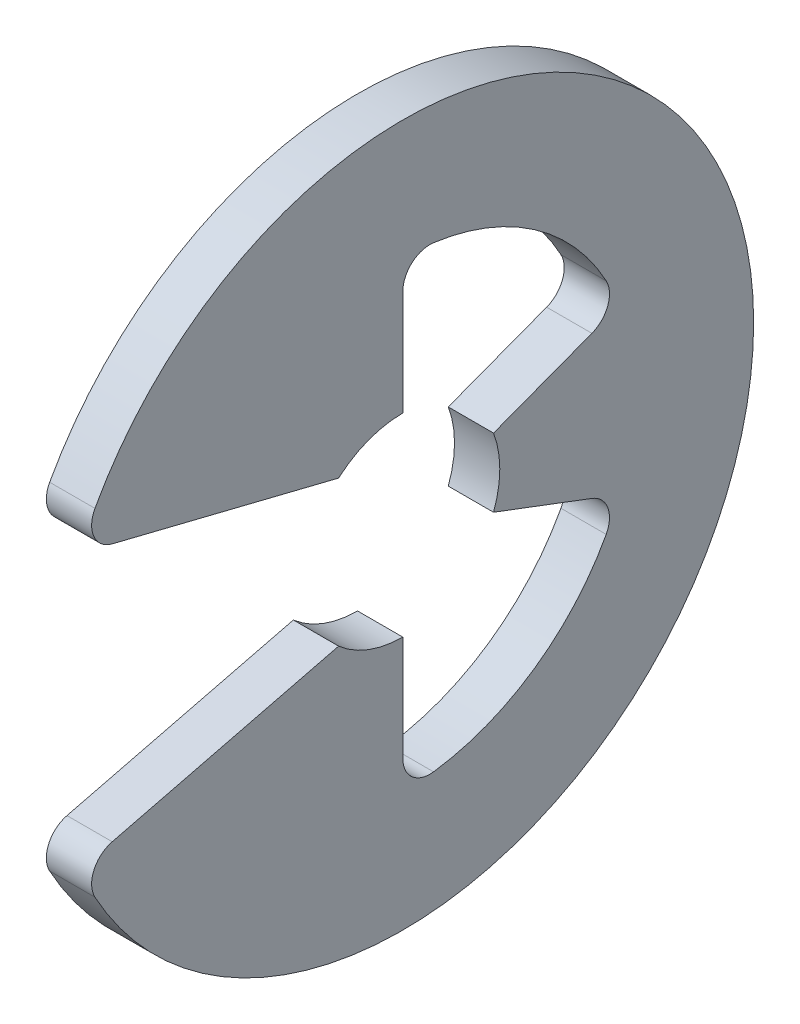
ISO-10303-21;
HEADER;
FILE_DESCRIPTION(('STEP AP214'),'2;1');
FILE_NAME('part.step','',(''),(''),'','','');
FILE_SCHEMA(('AUTOMOTIVE_DESIGN { 1 0 10303 214 1 1 1 1 }'));
ENDSEC;
DATA;
#1=APPLICATION_CONTEXT('core data for automotive mechanical design processes');
#2=APPLICATION_PROTOCOL_DEFINITION('international standard','automotive_design',2000,#1);
#3=PRODUCT_CONTEXT('',#1,'mechanical');
#4=PRODUCT('Part','Part','',(#3));
#5=PRODUCT_RELATED_PRODUCT_CATEGORY('part','',(#4));
#6=PRODUCT_DEFINITION_FORMATION('','',#4);
#7=PRODUCT_DEFINITION_CONTEXT('part definition',#1,'design');
#8=PRODUCT_DEFINITION('design','',#6,#7);
#9=PRODUCT_DEFINITION_SHAPE('','',#8);
#10=(LENGTH_UNIT() NAMED_UNIT(*) SI_UNIT(.MILLI.,.METRE.));
#11=(NAMED_UNIT(*) PLANE_ANGLE_UNIT() SI_UNIT($,.RADIAN.));
#12=(NAMED_UNIT(*) SI_UNIT($,.STERADIAN.) SOLID_ANGLE_UNIT());
#13=UNCERTAINTY_MEASURE_WITH_UNIT(LENGTH_MEASURE(1.E-05),#10,'distance_accuracy_value','');
#14=(GEOMETRIC_REPRESENTATION_CONTEXT(3) GLOBAL_UNCERTAINTY_ASSIGNED_CONTEXT((#13)) GLOBAL_UNIT_ASSIGNED_CONTEXT((#10,
#11,#12)) REPRESENTATION_CONTEXT('',''));
#15=CARTESIAN_POINT('',(0.,0.,0.));
#16=DIRECTION('',(0.,0.,1.));
#17=DIRECTION('',(1.,0.,0.));
#18=AXIS2_PLACEMENT_3D('',#15,#16,#17);
#19=CARTESIAN_POINT('',(0.35,0.,0.));
#20=DIRECTION('',(-1.,0.,0.));
#21=DIRECTION('',(0.,0.,1.));
#22=AXIS2_PLACEMENT_3D('',#19,#20,#21);
#23=CYLINDRICAL_SURFACE('',#22,5.425);
#24=CARTESIAN_POINT('',(0.35,0.,0.));
#25=DIRECTION('',(1.,0.,0.));
#26=DIRECTION('',(0.,0.,-1.));
#27=AXIS2_PLACEMENT_3D('',#24,#25,#26);
#28=CIRCLE('',#27,5.425);
#29=CARTESIAN_POINT('',(0.35,-2.60314628903045,4.75964855823484));
#30=VERTEX_POINT('',#29);
#31=CARTESIAN_POINT('',(0.35,2.60314628903045,4.75964855823484));
#32=VERTEX_POINT('',#31);
#33=EDGE_CURVE('E185',#30,#32,#28,.T.);
#34=ORIENTED_EDGE('',*,*,#33,.F.);
#35=DIRECTION('',(-1.,0.,0.));
#36=VECTOR('',#35,1.);
#37=CARTESIAN_POINT('',(0.35,-2.60314628903045,4.75964855823484));
#38=LINE('',#37,#36);
#39=CARTESIAN_POINT('',(-0.35,-2.60314628903045,4.75964855823484));
#40=VERTEX_POINT('',#39);
#41=EDGE_CURVE('E314',#30,#40,#38,.T.);
#42=ORIENTED_EDGE('',*,*,#41,.T.);
#43=CARTESIAN_POINT('',(-0.35,0.,0.));
#44=DIRECTION('',(1.,0.,0.));
#45=DIRECTION('',(0.,0.,-1.));
#46=AXIS2_PLACEMENT_3D('',#43,#44,#45);
#47=CIRCLE('',#46,5.425);
#48=CARTESIAN_POINT('',(-0.35,2.60314628903045,4.75964855823484));
#49=VERTEX_POINT('',#48);
#50=EDGE_CURVE('E234',#40,#49,#47,.T.);
#51=ORIENTED_EDGE('',*,*,#50,.T.);
#52=DIRECTION('',(-1.,0.,0.));
#53=VECTOR('',#52,1.);
#54=CARTESIAN_POINT('',(0.35,2.60314628903045,4.75964855823484));
#55=LINE('',#54,#53);
#56=EDGE_CURVE('E311',#49,#32,#55,.F.);
#57=ORIENTED_EDGE('',*,*,#56,.T.);
#58=EDGE_LOOP('',(#34,#42,#51,#57));
#59=FACE_BOUND('',#58,.T.);
#60=ADVANCED_FACE('F45',(#59),#23,.T.);
#61=CARTESIAN_POINT('',(0.35,2.11858251423971,4.9942199721636));
#62=DIRECTION('',(0.,0.970536829925373,-0.240952820606873));
#63=DIRECTION('',(0.,0.240952820606873,0.970536829925373));
#64=AXIS2_PLACEMENT_3D('',#61,#62,#63);
#65=PLANE('',#64);
#66=DIRECTION('',(0.,-0.240952820606873,-0.970536829925373));
#67=VECTOR('',#66,1.);
#68=CARTESIAN_POINT('',(0.35,2.11858251423971,4.9942199721636));
#69=LINE('',#68,#67);
#70=CARTESIAN_POINT('',(0.35,1.99398691421427,4.49235982225219));
#71=VERTEX_POINT('',#70);
#72=CARTESIAN_POINT('',(0.35,1.125,0.992156741649222));
#73=VERTEX_POINT('',#72);
#74=EDGE_CURVE('E170',#71,#73,#69,.T.);
#75=ORIENTED_EDGE('',*,*,#74,.F.);
#76=DIRECTION('',(-1.,0.,0.));
#77=VECTOR('',#76,1.);
#78=CARTESIAN_POINT('',(0.35,1.99398691421427,4.49235982225219));
#79=LINE('',#78,#77);
#80=CARTESIAN_POINT('',(-0.35,1.99398691421427,4.49235982225219));
#81=VERTEX_POINT('',#80);
#82=EDGE_CURVE('E332',#71,#81,#79,.T.);
#83=ORIENTED_EDGE('',*,*,#82,.T.);
#84=DIRECTION('',(0.,-0.240952820606873,-0.970536829925373));
#85=VECTOR('',#84,1.);
#86=CARTESIAN_POINT('',(-0.35,2.11858251423971,4.9942199721636));
#87=LINE('',#86,#85);
#88=CARTESIAN_POINT('',(-0.35,1.125,0.992156741649222));
#89=VERTEX_POINT('',#88);
#90=EDGE_CURVE('E191',#81,#89,#87,.T.);
#91=ORIENTED_EDGE('',*,*,#90,.T.);
#92=DIRECTION('',(-1.,0.,0.));
#93=VECTOR('',#92,1.);
#94=CARTESIAN_POINT('',(0.35,1.125,0.992156741649222));
#95=LINE('',#94,#93);
#96=EDGE_CURVE('E188',#73,#89,#95,.T.);
#97=ORIENTED_EDGE('',*,*,#96,.F.);
#98=EDGE_LOOP('',(#75,#83,#91,#97));
#99=FACE_BOUND('',#98,.T.);
#100=ADVANCED_FACE('F189',(#99),#65,.F.);
#101=CARTESIAN_POINT('',(0.35,0.,0.));
#102=DIRECTION('',(-1.,0.,0.));
#103=DIRECTION('',(0.,0.,1.));
#104=AXIS2_PLACEMENT_3D('',#101,#102,#103);
#105=CYLINDRICAL_SURFACE('',#104,1.5);
#106=CARTESIAN_POINT('',(-0.35,0.,0.));
#107=DIRECTION('',(-1.,0.,0.));
#108=DIRECTION('',(0.,0.,1.));
#109=AXIS2_PLACEMENT_3D('',#106,#107,#108);
#110=CIRCLE('',#109,1.5);
#111=CARTESIAN_POINT('',(-0.35,1.5,0.));
#112=VERTEX_POINT('',#111);
#113=EDGE_CURVE('E240',#89,#112,#110,.T.);
#114=ORIENTED_EDGE('',*,*,#113,.T.);
#115=DIRECTION('',(-1.,0.,0.));
#116=VECTOR('',#115,1.);
#117=CARTESIAN_POINT('',(0.35,1.5,0.));
#118=LINE('',#117,#116);
#119=CARTESIAN_POINT('',(0.35,1.5,0.));
#120=VERTEX_POINT('',#119);
#121=EDGE_CURVE('E196',#120,#112,#118,.T.);
#122=ORIENTED_EDGE('',*,*,#121,.F.);
#123=CARTESIAN_POINT('',(0.35,0.,0.));
#124=DIRECTION('',(-1.,0.,0.));
#125=DIRECTION('',(0.,0.,1.));
#126=AXIS2_PLACEMENT_3D('',#123,#124,#125);
#127=CIRCLE('',#126,1.5);
#128=EDGE_CURVE('E176',#73,#120,#127,.T.);
#129=ORIENTED_EDGE('',*,*,#128,.F.);
#130=ORIENTED_EDGE('',*,*,#96,.T.);
#131=EDGE_LOOP('',(#114,#122,#129,#130));
#132=FACE_BOUND('',#131,.T.);
#133=ADVANCED_FACE('F198',(#132),#105,.F.);
#134=CARTESIAN_POINT('',(0.35,1.5,0.));
#135=DIRECTION('',(0.,0.,1.));
#136=DIRECTION('',(0.,-1.,0.));
#137=AXIS2_PLACEMENT_3D('',#134,#135,#136);
#138=PLANE('',#137);
#139=DIRECTION('',(0.,1.,0.));
#140=VECTOR('',#139,1.);
#141=CARTESIAN_POINT('',(-0.35,1.5,0.));
#142=LINE('',#141,#140);
#143=CARTESIAN_POINT('',(-0.35,3.12610571489302,0.));
#144=VERTEX_POINT('',#143);
#145=EDGE_CURVE('E243',#112,#144,#142,.T.);
#146=ORIENTED_EDGE('',*,*,#145,.T.);
#147=DIRECTION('',(1.,0.,0.));
#148=VECTOR('',#147,1.);
#149=CARTESIAN_POINT('',(0.35,3.12610571489302,0.));
#150=LINE('',#149,#148);
#151=CARTESIAN_POINT('',(0.35,3.12610571489302,0.));
#152=VERTEX_POINT('',#151);
#153=EDGE_CURVE('E308',#144,#152,#150,.T.);
#154=ORIENTED_EDGE('',*,*,#153,.T.);
#155=DIRECTION('',(0.,1.,0.));
#156=VECTOR('',#155,1.);
#157=CARTESIAN_POINT('',(0.35,1.5,0.));
#158=LINE('',#157,#156);
#159=EDGE_CURVE('E202',#120,#152,#158,.T.);
#160=ORIENTED_EDGE('',*,*,#159,.F.);
#161=ORIENTED_EDGE('',*,*,#121,.T.);
#162=EDGE_LOOP('',(#146,#154,#160,#161));
#163=FACE_BOUND('',#162,.T.);
#164=ADVANCED_FACE('F451',(#163),#138,.F.);
#165=CARTESIAN_POINT('',(0.35,0.,0.));
#166=DIRECTION('',(-1.,0.,0.));
#167=DIRECTION('',(0.,0.,1.));
#168=AXIS2_PLACEMENT_3D('',#165,#166,#167);
#169=CYLINDRICAL_SURFACE('',#168,3.5741935483871);
#170=CARTESIAN_POINT('',(0.35,0.,0.));
#171=DIRECTION('',(-1.,0.,0.));
#172=DIRECTION('',(0.,0.,-1.));
#173=AXIS2_PLACEMENT_3D('',#170,#171,#172);
#174=CIRCLE('',#173,3.5741935483871);
#175=CARTESIAN_POINT('',(0.35,3.54236564952083,-0.475925547146655));
#176=VERTEX_POINT('',#175);
#177=CARTESIAN_POINT('',(0.35,1.69760297086816,-3.14531455893231));
#178=VERTEX_POINT('',#177);
#179=EDGE_CURVE('E205',#176,#178,#174,.T.);
#180=ORIENTED_EDGE('',*,*,#179,.F.);
#181=DIRECTION('',(-1.,0.,0.));
#182=VECTOR('',#181,1.);
#183=CARTESIAN_POINT('',(0.35,3.54236564952083,-0.475925547146655));
#184=LINE('',#183,#182);
#185=CARTESIAN_POINT('',(-0.35,3.54236564952083,-0.475925547146655));
#186=VERTEX_POINT('',#185);
#187=EDGE_CURVE('E304',#176,#186,#184,.T.);
#188=ORIENTED_EDGE('',*,*,#187,.T.);
#189=CARTESIAN_POINT('',(-0.35,0.,0.));
#190=DIRECTION('',(-1.,0.,0.));
#191=DIRECTION('',(0.,0.,-1.));
#192=AXIS2_PLACEMENT_3D('',#189,#190,#191);
#193=CIRCLE('',#192,3.5741935483871);
#194=CARTESIAN_POINT('',(-0.35,1.69760297086816,-3.14531455893231));
#195=VERTEX_POINT('',#194);
#196=EDGE_CURVE('E247',#186,#195,#193,.T.);
#197=ORIENTED_EDGE('',*,*,#196,.T.);
#198=DIRECTION('',(-1.,0.,0.));
#199=VECTOR('',#198,1.);
#200=CARTESIAN_POINT('',(0.35,1.69760297086816,-3.14531455893231));
#201=LINE('',#200,#199);
#202=EDGE_CURVE('E301',#195,#178,#201,.F.);
#203=ORIENTED_EDGE('',*,*,#202,.T.);
#204=EDGE_LOOP('',(#180,#188,#197,#203));
#205=FACE_BOUND('',#204,.T.);
#206=ADVANCED_FACE('F370',(#205),#169,.F.);
#207=CARTESIAN_POINT('',(0.35,0.530330085889911,-1.40312152004023));
#208=DIRECTION('',(0.,-0.935414346693485,-0.353553390593274));
#209=DIRECTION('',(0.,0.353553390593274,-0.935414346693485));
#210=AXIS2_PLACEMENT_3D('',#207,#208,#209);
#211=PLANE('',#210);
#212=DIRECTION('',(0.,-0.353553390593274,0.935414346693485));
#213=VECTOR('',#212,1.);
#214=CARTESIAN_POINT('',(0.35,0.530330085889911,-1.40312152004023));
#215=LINE('',#214,#213);
#216=CARTESIAN_POINT('',(0.35,1.10524527485344,-2.92420413499142));
#217=VERTEX_POINT('',#216);
#218=CARTESIAN_POINT('',(0.35,0.530330085889911,-1.40312152004023));
#219=VERTEX_POINT('',#218);
#220=EDGE_CURVE('E211',#217,#219,#215,.T.);
#221=ORIENTED_EDGE('',*,*,#220,.F.);
#222=DIRECTION('',(1.,0.,0.));
#223=VECTOR('',#222,1.);
#224=CARTESIAN_POINT('',(-0.35,1.10524527485344,-2.92420413499142));
#225=LINE('',#224,#223);
#226=CARTESIAN_POINT('',(-0.35,1.10524527485344,-2.92420413499142));
#227=VERTEX_POINT('',#226);
#228=EDGE_CURVE('E337',#217,#227,#225,.F.);
#229=ORIENTED_EDGE('',*,*,#228,.T.);
#230=DIRECTION('',(0.,-0.353553390593274,0.935414346693485));
#231=VECTOR('',#230,1.);
#232=CARTESIAN_POINT('',(-0.35,0.530330085889911,-1.40312152004023));
#233=LINE('',#232,#231);
#234=CARTESIAN_POINT('',(-0.35,0.530330085889911,-1.40312152004023));
#235=VERTEX_POINT('',#234);
#236=EDGE_CURVE('E251',#227,#235,#233,.T.);
#237=ORIENTED_EDGE('',*,*,#236,.T.);
#238=DIRECTION('',(-1.,0.,0.));
#239=VECTOR('',#238,1.);
#240=CARTESIAN_POINT('',(0.35,0.530330085889911,-1.40312152004023));
#241=LINE('',#240,#239);
#242=EDGE_CURVE('E285',#219,#235,#241,.T.);
#243=ORIENTED_EDGE('',*,*,#242,.F.);
#244=EDGE_LOOP('',(#221,#229,#237,#243));
#245=FACE_BOUND('',#244,.T.);
#246=ADVANCED_FACE('F373',(#245),#211,.F.);
#247=CARTESIAN_POINT('',(0.35,0.,0.));
#248=DIRECTION('',(-1.,0.,0.));
#249=DIRECTION('',(0.,0.,1.));
#250=AXIS2_PLACEMENT_3D('',#247,#248,#249);
#251=CYLINDRICAL_SURFACE('',#250,1.5);
#252=CARTESIAN_POINT('',(-0.35,0.,0.));
#253=DIRECTION('',(-1.,0.,0.));
#254=DIRECTION('',(0.,0.,1.));
#255=AXIS2_PLACEMENT_3D('',#252,#253,#254);
#256=CIRCLE('',#255,1.5);
#257=CARTESIAN_POINT('',(-0.35,-0.53033008588991,-1.40312152004023));
#258=VERTEX_POINT('',#257);
#259=EDGE_CURVE('E254',#235,#258,#256,.T.);
#260=ORIENTED_EDGE('',*,*,#259,.T.);
#261=DIRECTION('',(-1.,0.,0.));
#262=VECTOR('',#261,1.);
#263=CARTESIAN_POINT('',(0.35,-0.53033008588991,-1.40312152004023));
#264=LINE('',#263,#262);
#265=CARTESIAN_POINT('',(0.35,-0.53033008588991,-1.40312152004023));
#266=VERTEX_POINT('',#265);
#267=EDGE_CURVE('E281',#266,#258,#264,.T.);
#268=ORIENTED_EDGE('',*,*,#267,.F.);
#269=CARTESIAN_POINT('',(0.35,0.,0.));
#270=DIRECTION('',(-1.,0.,0.));
#271=DIRECTION('',(0.,0.,1.));
#272=AXIS2_PLACEMENT_3D('',#269,#270,#271);
#273=CIRCLE('',#272,1.5);
#274=EDGE_CURVE('E214',#219,#266,#273,.T.);
#275=ORIENTED_EDGE('',*,*,#274,.F.);
#276=ORIENTED_EDGE('',*,*,#242,.T.);
#277=EDGE_LOOP('',(#260,#268,#275,#276));
#278=FACE_BOUND('',#277,.T.);
#279=ADVANCED_FACE('F379',(#278),#251,.F.);
#280=CARTESIAN_POINT('',(0.35,-0.53033008588991,-1.40312152004023));
#281=DIRECTION('',(0.,0.935414346693485,-0.353553390593273));
#282=DIRECTION('',(0.,0.353553390593273,0.935414346693485));
#283=AXIS2_PLACEMENT_3D('',#280,#281,#282);
#284=PLANE('',#283);
#285=DIRECTION('',(0.,-0.353553390593273,-0.935414346693485));
#286=VECTOR('',#285,1.);
#287=CARTESIAN_POINT('',(-0.35,-0.53033008588991,-1.40312152004023));
#288=LINE('',#287,#286);
#289=CARTESIAN_POINT('',(-0.35,-1.10524527485344,-2.92420413499142));
#290=VERTEX_POINT('',#289);
#291=EDGE_CURVE('E257',#258,#290,#288,.T.);
#292=ORIENTED_EDGE('',*,*,#291,.T.);
#293=DIRECTION('',(1.,0.,0.));
#294=VECTOR('',#293,1.);
#295=CARTESIAN_POINT('',(0.35,-1.10524527485344,-2.92420413499142));
#296=LINE('',#295,#294);
#297=CARTESIAN_POINT('',(0.35,-1.10524527485344,-2.92420413499142));
#298=VERTEX_POINT('',#297);
#299=EDGE_CURVE('E61',#290,#298,#296,.T.);
#300=ORIENTED_EDGE('',*,*,#299,.T.);
#301=DIRECTION('',(0.,-0.353553390593273,-0.935414346693485));
#302=VECTOR('',#301,1.);
#303=CARTESIAN_POINT('',(0.35,-0.53033008588991,-1.40312152004023));
#304=LINE('',#303,#302);
#305=EDGE_CURVE('E217',#266,#298,#304,.T.);
#306=ORIENTED_EDGE('',*,*,#305,.F.);
#307=ORIENTED_EDGE('',*,*,#267,.T.);
#308=EDGE_LOOP('',(#292,#300,#306,#307));
#309=FACE_BOUND('',#308,.T.);
#310=ADVANCED_FACE('F381',(#309),#284,.F.);
#311=CARTESIAN_POINT('',(0.35,0.,0.));
#312=DIRECTION('',(-1.,0.,0.));
#313=DIRECTION('',(0.,0.,1.));
#314=AXIS2_PLACEMENT_3D('',#311,#312,#313);
#315=CYLINDRICAL_SURFACE('',#314,3.5741935483871);
#316=CARTESIAN_POINT('',(-0.35,0.,0.));
#317=DIRECTION('',(-1.,0.,0.));
#318=DIRECTION('',(0.,0.,-1.));
#319=AXIS2_PLACEMENT_3D('',#316,#317,#318);
#320=CIRCLE('',#319,3.5741935483871);
#321=CARTESIAN_POINT('',(-0.35,-1.69760297086816,-3.14531455893231));
#322=VERTEX_POINT('',#321);
#323=CARTESIAN_POINT('',(-0.35,-3.54236564952083,-0.475925547146656));
#324=VERTEX_POINT('',#323);
#325=EDGE_CURVE('E260',#322,#324,#320,.T.);
#326=ORIENTED_EDGE('',*,*,#325,.T.);
#327=DIRECTION('',(-1.,0.,0.));
#328=VECTOR('',#327,1.);
#329=CARTESIAN_POINT('',(0.35,-3.54236564952083,-0.475925547146656));
#330=LINE('',#329,#328);
#331=CARTESIAN_POINT('',(0.35,-3.54236564952083,-0.475925547146656));
#332=VERTEX_POINT('',#331);
#333=EDGE_CURVE('E298',#324,#332,#330,.F.);
#334=ORIENTED_EDGE('',*,*,#333,.T.);
#335=CARTESIAN_POINT('',(0.35,0.,0.));
#336=DIRECTION('',(-1.,0.,0.));
#337=DIRECTION('',(0.,0.,-1.));
#338=AXIS2_PLACEMENT_3D('',#335,#336,#337);
#339=CIRCLE('',#338,3.5741935483871);
#340=CARTESIAN_POINT('',(0.35,-1.69760297086816,-3.14531455893231));
#341=VERTEX_POINT('',#340);
#342=EDGE_CURVE('E220',#341,#332,#339,.T.);
#343=ORIENTED_EDGE('',*,*,#342,.F.);
#344=DIRECTION('',(-1.,0.,0.));
#345=VECTOR('',#344,1.);
#346=CARTESIAN_POINT('',(0.35,-1.69760297086816,-3.14531455893231));
#347=LINE('',#346,#345);
#348=EDGE_CURVE('E294',#341,#322,#347,.T.);
#349=ORIENTED_EDGE('',*,*,#348,.T.);
#350=EDGE_LOOP('',(#326,#334,#343,#349));
#351=FACE_BOUND('',#350,.T.);
#352=ADVANCED_FACE('F383',(#351),#315,.F.);
#353=CARTESIAN_POINT('',(0.35,-1.5,0.));
#354=DIRECTION('',(0.,0.,1.));
#355=DIRECTION('',(0.,-1.,0.));
#356=AXIS2_PLACEMENT_3D('',#353,#354,#355);
#357=PLANE('',#356);
#358=DIRECTION('',(0.,1.,0.));
#359=VECTOR('',#358,1.);
#360=CARTESIAN_POINT('',(0.35,-1.5,0.));
#361=LINE('',#360,#359);
#362=CARTESIAN_POINT('',(0.35,-3.12610571489302,0.));
#363=VERTEX_POINT('',#362);
#364=CARTESIAN_POINT('',(0.35,-1.5,0.));
#365=VERTEX_POINT('',#364);
#366=EDGE_CURVE('E224',#363,#365,#361,.T.);
#367=ORIENTED_EDGE('',*,*,#366,.F.);
#368=DIRECTION('',(1.,0.,0.));
#369=VECTOR('',#368,1.);
#370=CARTESIAN_POINT('',(-0.35,-3.12610571489302,0.));
#371=LINE('',#370,#369);
#372=CARTESIAN_POINT('',(-0.35,-3.12610571489302,0.));
#373=VERTEX_POINT('',#372);
#374=EDGE_CURVE('E195',#363,#373,#371,.F.);
#375=ORIENTED_EDGE('',*,*,#374,.T.);
#376=DIRECTION('',(0.,1.,0.));
#377=VECTOR('',#376,1.);
#378=CARTESIAN_POINT('',(-0.35,-1.5,0.));
#379=LINE('',#378,#377);
#380=CARTESIAN_POINT('',(-0.35,-1.5,0.));
#381=VERTEX_POINT('',#380);
#382=EDGE_CURVE('E264',#373,#381,#379,.T.);
#383=ORIENTED_EDGE('',*,*,#382,.T.);
#384=DIRECTION('',(-1.,0.,0.));
#385=VECTOR('',#384,1.);
#386=CARTESIAN_POINT('',(0.35,-1.5,0.));
#387=LINE('',#386,#385);
#388=EDGE_CURVE('E277',#365,#381,#387,.T.);
#389=ORIENTED_EDGE('',*,*,#388,.F.);
#390=EDGE_LOOP('',(#367,#375,#383,#389));
#391=FACE_BOUND('',#390,.T.);
#392=ADVANCED_FACE('F389',(#391),#357,.F.);
#393=CARTESIAN_POINT('',(0.35,0.,0.));
#394=DIRECTION('',(-1.,0.,0.));
#395=DIRECTION('',(0.,0.,1.));
#396=AXIS2_PLACEMENT_3D('',#393,#394,#395);
#397=CYLINDRICAL_SURFACE('',#396,1.5);
#398=CARTESIAN_POINT('',(-0.35,0.,0.));
#399=DIRECTION('',(-1.,0.,0.));
#400=DIRECTION('',(0.,0.,-1.));
#401=AXIS2_PLACEMENT_3D('',#398,#399,#400);
#402=CIRCLE('',#401,1.5);
#403=CARTESIAN_POINT('',(-0.35,-1.125,0.992156741649221));
#404=VERTEX_POINT('',#403);
#405=EDGE_CURVE('E267',#381,#404,#402,.T.);
#406=ORIENTED_EDGE('',*,*,#405,.T.);
#407=DIRECTION('',(-1.,0.,0.));
#408=VECTOR('',#407,1.);
#409=CARTESIAN_POINT('',(0.35,-1.125,0.992156741649221));
#410=LINE('',#409,#408);
#411=CARTESIAN_POINT('',(0.35,-1.125,0.992156741649221));
#412=VERTEX_POINT('',#411);
#413=EDGE_CURVE('E233',#412,#404,#410,.T.);
#414=ORIENTED_EDGE('',*,*,#413,.F.);
#415=CARTESIAN_POINT('',(0.35,0.,0.));
#416=DIRECTION('',(-1.,0.,0.));
#417=DIRECTION('',(0.,0.,-1.));
#418=AXIS2_PLACEMENT_3D('',#415,#416,#417);
#419=CIRCLE('',#418,1.5);
#420=EDGE_CURVE('E227',#365,#412,#419,.T.);
#421=ORIENTED_EDGE('',*,*,#420,.F.);
#422=ORIENTED_EDGE('',*,*,#388,.T.);
#423=EDGE_LOOP('',(#406,#414,#421,#422));
#424=FACE_BOUND('',#423,.T.);
#425=ADVANCED_FACE('F440',(#424),#397,.F.);
#426=CARTESIAN_POINT('',(0.35,-2.11858251423971,4.99421997216359));
#427=DIRECTION('',(0.,-0.970536829925373,-0.240952820606873));
#428=DIRECTION('',(0.,0.240952820606873,-0.970536829925373));
#429=AXIS2_PLACEMENT_3D('',#426,#427,#428);
#430=PLANE('',#429);
#431=DIRECTION('',(0.,-0.240952820606873,0.970536829925373));
#432=VECTOR('',#431,1.);
#433=CARTESIAN_POINT('',(-0.35,-2.11858251423971,4.99421997216359));
#434=LINE('',#433,#432);
#435=CARTESIAN_POINT('',(-0.35,-1.99398691421427,4.49235982225219));
#436=VERTEX_POINT('',#435);
#437=EDGE_CURVE('E270',#404,#436,#434,.T.);
#438=ORIENTED_EDGE('',*,*,#437,.T.);
#439=DIRECTION('',(-1.,0.,0.));
#440=VECTOR('',#439,1.);
#441=CARTESIAN_POINT('',(0.35,-1.99398691421427,4.49235982225219));
#442=LINE('',#441,#440);
#443=CARTESIAN_POINT('',(0.35,-1.99398691421427,4.49235982225219));
#444=VERTEX_POINT('',#443);
#445=EDGE_CURVE('E324',#436,#444,#442,.F.);
#446=ORIENTED_EDGE('',*,*,#445,.T.);
#447=DIRECTION('',(0.,-0.240952820606873,0.970536829925373));
#448=VECTOR('',#447,1.);
#449=CARTESIAN_POINT('',(0.35,-2.11858251423971,4.99421997216359));
#450=LINE('',#449,#448);
#451=EDGE_CURVE('E230',#412,#444,#450,.T.);
#452=ORIENTED_EDGE('',*,*,#451,.F.);
#453=ORIENTED_EDGE('',*,*,#413,.T.);
#454=EDGE_LOOP('',(#438,#446,#452,#453));
#455=FACE_BOUND('',#454,.T.);
#456=ADVANCED_FACE('F500',(#455),#430,.F.);
#457=CARTESIAN_POINT('',(0.35,0.,0.));
#458=DIRECTION('',(1.,0.,0.));
#459=DIRECTION('',(0.,0.,-1.));
#460=AXIS2_PLACEMENT_3D('',#457,#458,#459);
#461=PLANE('',#460);
#462=ORIENTED_EDGE('',*,*,#451,.T.);
#463=CARTESIAN_POINT('',(0.35,-2.40161238278293,4.3911596375973));
#464=DIRECTION('',(1.,0.,0.));
#465=DIRECTION('',(0.,0.,-1.));
#466=AXIS2_PLACEMENT_3D('',#463,#464,#465);
#467=CIRCLE('',#466,0.42);
#468=EDGE_CURVE('E329',#444,#30,#467,.T.);
#469=ORIENTED_EDGE('',*,*,#468,.T.);
#470=ORIENTED_EDGE('',*,*,#33,.T.);
#471=CARTESIAN_POINT('',(0.35,2.40161238278293,4.3911596375973));
#472=DIRECTION('',(1.,0.,0.));
#473=DIRECTION('',(0.,0.,-1.));
#474=AXIS2_PLACEMENT_3D('',#471,#472,#473);
#475=CIRCLE('',#474,0.42);
#476=EDGE_CURVE('E180',#32,#71,#475,.T.);
#477=ORIENTED_EDGE('',*,*,#476,.T.);
#478=ORIENTED_EDGE('',*,*,#74,.T.);
#479=ORIENTED_EDGE('',*,*,#128,.T.);
#480=ORIENTED_EDGE('',*,*,#159,.T.);
#481=CARTESIAN_POINT('',(0.35,3.12610571489302,-0.419999999999999));
#482=DIRECTION('',(1.,0.,0.));
#483=DIRECTION('',(0.,0.,-1.));
#484=AXIS2_PLACEMENT_3D('',#481,#482,#483);
#485=CIRCLE('',#484,0.42);
#486=EDGE_CURVE('E350',#152,#176,#485,.F.);
#487=ORIENTED_EDGE('',*,*,#486,.T.);
#488=ORIENTED_EDGE('',*,*,#179,.T.);
#489=CARTESIAN_POINT('',(0.35,1.4981193004647,-2.77571171094225));
#490=DIRECTION('',(1.,0.,0.));
#491=DIRECTION('',(0.,0.,-1.));
#492=AXIS2_PLACEMENT_3D('',#489,#490,#491);
#493=CIRCLE('',#492,0.42);
#494=EDGE_CURVE('E11',#178,#217,#493,.F.);
#495=ORIENTED_EDGE('',*,*,#494,.T.);
#496=ORIENTED_EDGE('',*,*,#220,.T.);
#497=ORIENTED_EDGE('',*,*,#274,.T.);
#498=ORIENTED_EDGE('',*,*,#305,.T.);
#499=CARTESIAN_POINT('',(0.35,-1.4981193004647,-2.77571171094225));
#500=DIRECTION('',(1.,0.,0.));
#501=DIRECTION('',(0.,0.,-1.));
#502=AXIS2_PLACEMENT_3D('',#499,#500,#501);
#503=CIRCLE('',#502,0.42);
#504=EDGE_CURVE('E356',#298,#341,#503,.F.);
#505=ORIENTED_EDGE('',*,*,#504,.T.);
#506=ORIENTED_EDGE('',*,*,#342,.T.);
#507=CARTESIAN_POINT('',(0.35,-3.12610571489302,-0.42));
#508=DIRECTION('',(1.,0.,0.));
#509=DIRECTION('',(0.,0.,-1.));
#510=AXIS2_PLACEMENT_3D('',#507,#508,#509);
#511=CIRCLE('',#510,0.42);
#512=EDGE_CURVE('E344',#332,#363,#511,.F.);
#513=ORIENTED_EDGE('',*,*,#512,.T.);
#514=ORIENTED_EDGE('',*,*,#366,.T.);
#515=ORIENTED_EDGE('',*,*,#420,.T.);
#516=EDGE_LOOP('',(#462,#469,#470,#477,#478,#479,#480,#487,#488,#495,#496,#497,#498,#505,#506,
#513,#514,#515));
#517=FACE_BOUND('',#516,.T.);
#518=ADVANCED_FACE('F173',(#517),#461,.T.);
#519=CARTESIAN_POINT('',(-0.35,0.,0.));
#520=DIRECTION('',(1.,0.,0.));
#521=DIRECTION('',(0.,0.,-1.));
#522=AXIS2_PLACEMENT_3D('',#519,#520,#521);
#523=PLANE('',#522);
#524=ORIENTED_EDGE('',*,*,#50,.F.);
#525=CARTESIAN_POINT('',(-0.35,-2.40161238278293,4.3911596375973));
#526=DIRECTION('',(1.,0.,0.));
#527=DIRECTION('',(0.,0.,-1.));
#528=AXIS2_PLACEMENT_3D('',#525,#526,#527);
#529=CIRCLE('',#528,0.42);
#530=EDGE_CURVE('E321',#40,#436,#529,.F.);
#531=ORIENTED_EDGE('',*,*,#530,.T.);
#532=ORIENTED_EDGE('',*,*,#437,.F.);
#533=ORIENTED_EDGE('',*,*,#405,.F.);
#534=ORIENTED_EDGE('',*,*,#382,.F.);
#535=CARTESIAN_POINT('',(-0.35,-3.12610571489302,-0.42));
#536=DIRECTION('',(1.,0.,0.));
#537=DIRECTION('',(0.,0.,-1.));
#538=AXIS2_PLACEMENT_3D('',#535,#536,#537);
#539=CIRCLE('',#538,0.42);
#540=EDGE_CURVE('E341',#373,#324,#539,.T.);
#541=ORIENTED_EDGE('',*,*,#540,.T.);
#542=ORIENTED_EDGE('',*,*,#325,.F.);
#543=CARTESIAN_POINT('',(-0.35,-1.4981193004647,-2.77571171094225));
#544=DIRECTION('',(1.,0.,0.));
#545=DIRECTION('',(0.,0.,-1.));
#546=AXIS2_PLACEMENT_3D('',#543,#544,#545);
#547=CIRCLE('',#546,0.42);
#548=EDGE_CURVE('E353',#322,#290,#547,.T.);
#549=ORIENTED_EDGE('',*,*,#548,.T.);
#550=ORIENTED_EDGE('',*,*,#291,.F.);
#551=ORIENTED_EDGE('',*,*,#259,.F.);
#552=ORIENTED_EDGE('',*,*,#236,.F.);
#553=CARTESIAN_POINT('',(-0.35,1.4981193004647,-2.77571171094225));
#554=DIRECTION('',(1.,0.,0.));
#555=DIRECTION('',(0.,0.,-1.));
#556=AXIS2_PLACEMENT_3D('',#553,#554,#555);
#557=CIRCLE('',#556,0.42);
#558=EDGE_CURVE('E54',#227,#195,#557,.T.);
#559=ORIENTED_EDGE('',*,*,#558,.T.);
#560=ORIENTED_EDGE('',*,*,#196,.F.);
#561=CARTESIAN_POINT('',(-0.35,3.12610571489302,-0.419999999999999));
#562=DIRECTION('',(1.,0.,0.));
#563=DIRECTION('',(0.,0.,-1.));
#564=AXIS2_PLACEMENT_3D('',#561,#562,#563);
#565=CIRCLE('',#564,0.42);
#566=EDGE_CURVE('E347',#186,#144,#565,.T.);
#567=ORIENTED_EDGE('',*,*,#566,.T.);
#568=ORIENTED_EDGE('',*,*,#145,.F.);
#569=ORIENTED_EDGE('',*,*,#113,.F.);
#570=ORIENTED_EDGE('',*,*,#90,.F.);
#571=CARTESIAN_POINT('',(-0.35,2.40161238278293,4.3911596375973));
#572=DIRECTION('',(1.,0.,0.));
#573=DIRECTION('',(0.,0.,-1.));
#574=AXIS2_PLACEMENT_3D('',#571,#572,#573);
#575=CIRCLE('',#574,0.42);
#576=EDGE_CURVE('E318',#81,#49,#575,.F.);
#577=ORIENTED_EDGE('',*,*,#576,.T.);
#578=EDGE_LOOP('',(#524,#531,#532,#533,#534,#541,#542,#549,#550,#551,#552,#559,#560,#567,#568,
#569,#570,#577));
#579=FACE_BOUND('',#578,.T.);
#580=ADVANCED_FACE('F363',(#579),#523,.F.);
#581=CARTESIAN_POINT('',(0.35,-3.12610571489302,-0.42));
#582=DIRECTION('',(-1.,0.,0.));
#583=DIRECTION('',(0.,0.,1.));
#584=AXIS2_PLACEMENT_3D('',#581,#582,#583);
#585=CYLINDRICAL_SURFACE('',#584,0.42);
#586=ORIENTED_EDGE('',*,*,#512,.F.);
#587=ORIENTED_EDGE('',*,*,#333,.F.);
#588=ORIENTED_EDGE('',*,*,#540,.F.);
#589=ORIENTED_EDGE('',*,*,#374,.F.);
#590=EDGE_LOOP('',(#586,#587,#588,#589));
#591=FACE_BOUND('',#590,.T.);
#592=ADVANCED_FACE('F405',(#591),#585,.F.);
#593=CARTESIAN_POINT('',(0.35,3.12610571489302,-0.419999999999999));
#594=DIRECTION('',(-1.,0.,0.));
#595=DIRECTION('',(0.,0.,1.));
#596=AXIS2_PLACEMENT_3D('',#593,#594,#595);
#597=CYLINDRICAL_SURFACE('',#596,0.42);
#598=ORIENTED_EDGE('',*,*,#486,.F.);
#599=ORIENTED_EDGE('',*,*,#153,.F.);
#600=ORIENTED_EDGE('',*,*,#566,.F.);
#601=ORIENTED_EDGE('',*,*,#187,.F.);
#602=EDGE_LOOP('',(#598,#599,#600,#601));
#603=FACE_BOUND('',#602,.T.);
#604=ADVANCED_FACE('F408',(#603),#597,.F.);
#605=CARTESIAN_POINT('',(0.35,-2.40161238278293,4.3911596375973));
#606=DIRECTION('',(-1.,0.,0.));
#607=DIRECTION('',(0.,0.,1.));
#608=AXIS2_PLACEMENT_3D('',#605,#606,#607);
#609=CYLINDRICAL_SURFACE('',#608,0.42);
#610=ORIENTED_EDGE('',*,*,#468,.F.);
#611=ORIENTED_EDGE('',*,*,#445,.F.);
#612=ORIENTED_EDGE('',*,*,#530,.F.);
#613=ORIENTED_EDGE('',*,*,#41,.F.);
#614=EDGE_LOOP('',(#610,#611,#612,#613));
#615=FACE_BOUND('',#614,.T.);
#616=ADVANCED_FACE('F412',(#615),#609,.T.);
#617=CARTESIAN_POINT('',(0.35,2.40161238278293,4.3911596375973));
#618=DIRECTION('',(-1.,0.,0.));
#619=DIRECTION('',(0.,0.,1.));
#620=AXIS2_PLACEMENT_3D('',#617,#618,#619);
#621=CYLINDRICAL_SURFACE('',#620,0.42);
#622=ORIENTED_EDGE('',*,*,#476,.F.);
#623=ORIENTED_EDGE('',*,*,#56,.F.);
#624=ORIENTED_EDGE('',*,*,#576,.F.);
#625=ORIENTED_EDGE('',*,*,#82,.F.);
#626=EDGE_LOOP('',(#622,#623,#624,#625));
#627=FACE_BOUND('',#626,.T.);
#628=ADVANCED_FACE('F416',(#627),#621,.T.);
#629=CARTESIAN_POINT('',(0.35,-1.4981193004647,-2.77571171094225));
#630=DIRECTION('',(-1.,0.,0.));
#631=DIRECTION('',(0.,0.,1.));
#632=AXIS2_PLACEMENT_3D('',#629,#630,#631);
#633=CYLINDRICAL_SURFACE('',#632,0.42);
#634=ORIENTED_EDGE('',*,*,#504,.F.);
#635=ORIENTED_EDGE('',*,*,#299,.F.);
#636=ORIENTED_EDGE('',*,*,#548,.F.);
#637=ORIENTED_EDGE('',*,*,#348,.F.);
#638=EDGE_LOOP('',(#634,#635,#636,#637));
#639=FACE_BOUND('',#638,.T.);
#640=ADVANCED_FACE('F419',(#639),#633,.F.);
#641=CARTESIAN_POINT('',(0.35,1.4981193004647,-2.77571171094225));
#642=DIRECTION('',(-1.,0.,0.));
#643=DIRECTION('',(0.,0.,1.));
#644=AXIS2_PLACEMENT_3D('',#641,#642,#643);
#645=CYLINDRICAL_SURFACE('',#644,0.42);
#646=ORIENTED_EDGE('',*,*,#494,.F.);
#647=ORIENTED_EDGE('',*,*,#202,.F.);
#648=ORIENTED_EDGE('',*,*,#558,.F.);
#649=ORIENTED_EDGE('',*,*,#228,.F.);
#650=EDGE_LOOP('',(#646,#647,#648,#649));
#651=FACE_BOUND('',#650,.T.);
#652=ADVANCED_FACE('F47',(#651),#645,.F.);
#653=CLOSED_SHELL('',(#60,#100,#133,#164,#206,#246,#279,#310,#352,#392,#425,#456,#518,#580,#592,
#604,#616,#628,#640,#652));
#654=MANIFOLD_SOLID_BREP('B2',#653);
#655=ADVANCED_BREP_SHAPE_REPRESENTATION('',(#18,#654),#14);
#656=SHAPE_DEFINITION_REPRESENTATION(#9,#655);
ENDSEC;
END-ISO-10303-21;
